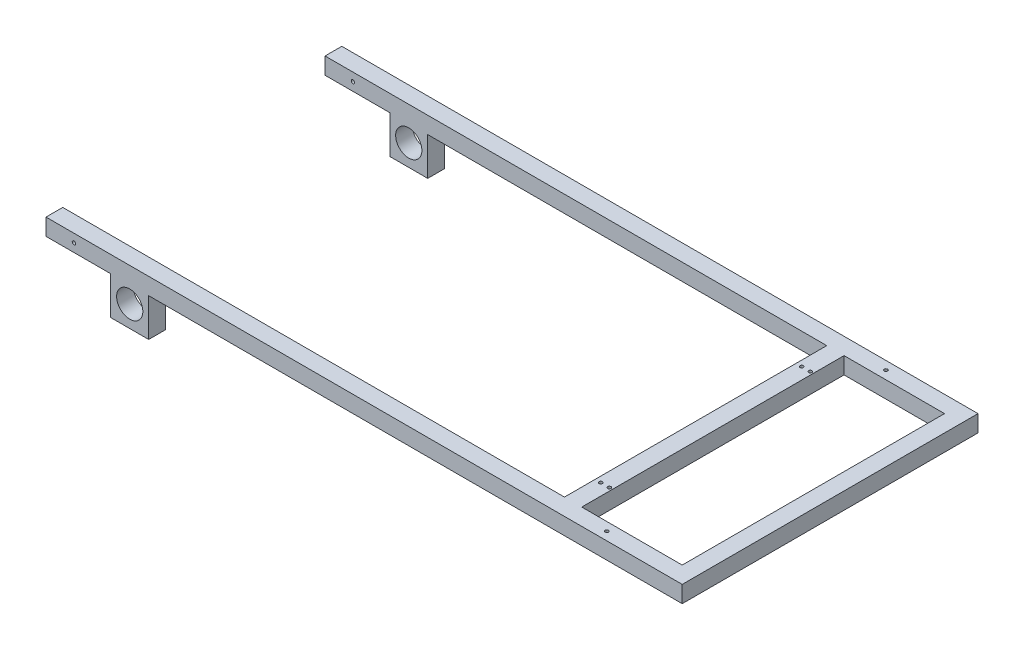
ISO-10303-21;
HEADER;
FILE_DESCRIPTION(('STEP AP214'),'2;1');
FILE_NAME('part.step','',(''),(''),'','','');
FILE_SCHEMA(('AUTOMOTIVE_DESIGN { 1 0 10303 214 1 1 1 1 }'));
ENDSEC;
DATA;
#1=APPLICATION_CONTEXT('core data for automotive mechanical design processes');
#2=APPLICATION_PROTOCOL_DEFINITION('international standard','automotive_design',2000,#1);
#3=PRODUCT_CONTEXT('',#1,'mechanical');
#4=PRODUCT('Part','Part','',(#3));
#5=PRODUCT_RELATED_PRODUCT_CATEGORY('part','',(#4));
#6=PRODUCT_DEFINITION_FORMATION('','',#4);
#7=PRODUCT_DEFINITION_CONTEXT('part definition',#1,'design');
#8=PRODUCT_DEFINITION('design','',#6,#7);
#9=PRODUCT_DEFINITION_SHAPE('','',#8);
#10=(LENGTH_UNIT() NAMED_UNIT(*) SI_UNIT(.MILLI.,.METRE.));
#11=(NAMED_UNIT(*) PLANE_ANGLE_UNIT() SI_UNIT($,.RADIAN.));
#12=(NAMED_UNIT(*) SI_UNIT($,.STERADIAN.) SOLID_ANGLE_UNIT());
#13=UNCERTAINTY_MEASURE_WITH_UNIT(LENGTH_MEASURE(1.E-05),#10,'distance_accuracy_value','');
#14=(GEOMETRIC_REPRESENTATION_CONTEXT(3) GLOBAL_UNCERTAINTY_ASSIGNED_CONTEXT((#13)) GLOBAL_UNIT_ASSIGNED_CONTEXT((#10,
#11,#12)) REPRESENTATION_CONTEXT('',''));
#15=CARTESIAN_POINT('',(0.,0.,0.));
#16=DIRECTION('',(0.,0.,1.));
#17=DIRECTION('',(1.,0.,0.));
#18=AXIS2_PLACEMENT_3D('',#15,#16,#17);
#19=CARTESIAN_POINT('',(0.,0.,0.));
#20=DIRECTION('',(0.,1.,0.));
#21=DIRECTION('',(0.,0.,1.));
#22=AXIS2_PLACEMENT_3D('',#19,#20,#21);
#23=PLANE('',#22);
#24=DIRECTION('',(1.,0.,0.));
#25=VECTOR('',#24,1.);
#26=CARTESIAN_POINT('',(-989.999999999999,0.,265.));
#27=LINE('',#26,#25);
#28=CARTESIAN_POINT('',(-150.,0.,265.));
#29=VERTEX_POINT('',#28);
#30=CARTESIAN_POINT('',(-34.,0.,265.));
#31=VERTEX_POINT('',#30);
#32=EDGE_CURVE('E206',#29,#31,#27,.T.);
#33=ORIENTED_EDGE('',*,*,#32,.F.);
#34=DIRECTION('',(0.,0.,1.));
#35=VECTOR('',#34,1.);
#36=CARTESIAN_POINT('',(-150.,0.,-265.));
#37=LINE('',#36,#35);
#38=CARTESIAN_POINT('',(-150.,0.,235.));
#39=VERTEX_POINT('',#38);
#40=EDGE_CURVE('E62',#39,#29,#37,.T.);
#41=ORIENTED_EDGE('',*,*,#40,.F.);
#42=DIRECTION('',(1.,0.,0.));
#43=VECTOR('',#42,1.);
#44=CARTESIAN_POINT('',(-959.999999999999,0.,235.));
#45=LINE('',#44,#43);
#46=CARTESIAN_POINT('',(-34.,0.,235.));
#47=VERTEX_POINT('',#46);
#48=EDGE_CURVE('E342',#39,#47,#45,.T.);
#49=ORIENTED_EDGE('',*,*,#48,.T.);
#50=DIRECTION('',(0.,0.,-1.));
#51=VECTOR('',#50,1.);
#52=CARTESIAN_POINT('',(-34.,0.,265.));
#53=LINE('',#52,#51);
#54=EDGE_CURVE('E311',#31,#47,#53,.T.);
#55=ORIENTED_EDGE('',*,*,#54,.F.);
#56=EDGE_LOOP('',(#33,#41,#49,#55));
#57=FACE_BOUND('',#56,.T.);
#58=ADVANCED_FACE('F37',(#57),#23,.F.);
#59=CARTESIAN_POINT('',(-959.999999999999,30.,-235.));
#60=DIRECTION('',(0.,0.,1.));
#61=DIRECTION('',(1.,0.,0.));
#62=AXIS2_PLACEMENT_3D('',#59,#60,#61);
#63=PLANE('',#62);
#64=CARTESIAN_POINT('',(-100.,15.0000000000003,-235.));
#65=DIRECTION('',(0.,0.,1.));
#66=DIRECTION('',(1.,0.,0.));
#67=AXIS2_PLACEMENT_3D('',#64,#65,#66);
#68=CIRCLE('',#67,3.00000000000001);
#69=CARTESIAN_POINT('',(-97.,15.0000000000003,-235.));
#70=VERTEX_POINT('',#69);
#71=EDGE_CURVE('E528',#70,#70,#68,.T.);
#72=ORIENTED_EDGE('',*,*,#71,.F.);
#73=EDGE_LOOP('',(#72));
#74=FACE_BOUND('',#73,.T.);
#75=DIRECTION('',(0.,1.,0.));
#76=VECTOR('',#75,1.);
#77=CARTESIAN_POINT('',(-150.,30.,-235.));
#78=LINE('',#77,#76);
#79=CARTESIAN_POINT('',(-150.,0.,-235.));
#80=VERTEX_POINT('',#79);
#81=CARTESIAN_POINT('',(-150.,30.0000000000005,-235.));
#82=VERTEX_POINT('',#81);
#83=EDGE_CURVE('E230',#80,#82,#78,.T.);
#84=ORIENTED_EDGE('',*,*,#83,.F.);
#85=DIRECTION('',(-1.,0.,0.));
#86=VECTOR('',#85,1.);
#87=CARTESIAN_POINT('',(-959.999999999999,0.,-235.));
#88=LINE('',#87,#86);
#89=CARTESIAN_POINT('',(-34.,0.,-235.));
#90=VERTEX_POINT('',#89);
#91=EDGE_CURVE('E189',#90,#80,#88,.T.);
#92=ORIENTED_EDGE('',*,*,#91,.F.);
#93=DIRECTION('',(0.,1.,0.));
#94=VECTOR('',#93,1.);
#95=CARTESIAN_POINT('',(-34.,-68.,-235.));
#96=LINE('',#95,#94);
#97=CARTESIAN_POINT('',(-34.,-68.,-235.));
#98=VERTEX_POINT('',#97);
#99=EDGE_CURVE('E298',#98,#90,#96,.T.);
#100=ORIENTED_EDGE('',*,*,#99,.F.);
#101=DIRECTION('',(-1.,0.,0.));
#102=VECTOR('',#101,1.);
#103=CARTESIAN_POINT('',(-34.,-68.,-235.));
#104=LINE('',#103,#102);
#105=CARTESIAN_POINT('',(34.,-68.,-235.));
#106=VERTEX_POINT('',#105);
#107=EDGE_CURVE('E296',#106,#98,#104,.T.);
#108=ORIENTED_EDGE('',*,*,#107,.F.);
#109=DIRECTION('',(0.,1.,0.));
#110=VECTOR('',#109,1.);
#111=CARTESIAN_POINT('',(34.,-68.,-235.));
#112=LINE('',#111,#110);
#113=CARTESIAN_POINT('',(33.9999999999999,0.,-235.));
#114=VERTEX_POINT('',#113);
#115=EDGE_CURVE('E304',#106,#114,#112,.T.);
#116=ORIENTED_EDGE('',*,*,#115,.T.);
#117=CARTESIAN_POINT('',(749.000000000001,0.,-235.));
#118=VERTEX_POINT('',#117);
#119=EDGE_CURVE('E356',#118,#114,#88,.T.);
#120=ORIENTED_EDGE('',*,*,#119,.F.);
#121=DIRECTION('',(0.,1.,0.));
#122=VECTOR('',#121,1.);
#123=CARTESIAN_POINT('',(749.000000000001,-471.021230943999,-235.));
#124=LINE('',#123,#122);
#125=CARTESIAN_POINT('',(749.000000000001,30.,-235.));
#126=VERTEX_POINT('',#125);
#127=EDGE_CURVE('E262',#118,#126,#124,.T.);
#128=ORIENTED_EDGE('',*,*,#127,.T.);
#129=DIRECTION('',(-1.,0.,0.));
#130=VECTOR('',#129,1.);
#131=CARTESIAN_POINT('',(-959.999999999999,30.,-235.));
#132=LINE('',#131,#130);
#133=EDGE_CURVE('E341',#126,#82,#132,.T.);
#134=ORIENTED_EDGE('',*,*,#133,.T.);
#135=EDGE_LOOP('',(#84,#92,#100,#108,#116,#120,#128,#134));
#136=FACE_BOUND('',#135,.T.);
#137=CARTESIAN_POINT('',(0.,-30.,-235.));
#138=DIRECTION('',(0.,0.,1.));
#139=DIRECTION('',(1.,0.,0.));
#140=AXIS2_PLACEMENT_3D('',#137,#138,#139);
#141=CIRCLE('',#140,23.5);
#142=CARTESIAN_POINT('',(23.5,-30.,-235.));
#143=VERTEX_POINT('',#142);
#144=EDGE_CURVE('E214',#143,#143,#141,.T.);
#145=ORIENTED_EDGE('',*,*,#144,.F.);
#146=EDGE_LOOP('',(#145));
#147=FACE_BOUND('',#146,.T.);
#148=ADVANCED_FACE('F385',(#74,#136,#147),#63,.T.);
#149=CARTESIAN_POINT('',(-959.999999999999,30.,235.));
#150=DIRECTION('',(0.,0.,-1.));
#151=DIRECTION('',(-1.,0.,0.));
#152=AXIS2_PLACEMENT_3D('',#149,#150,#151);
#153=PLANE('',#152);
#154=CARTESIAN_POINT('',(-100.,15.0000000000003,235.));
#155=DIRECTION('',(0.,0.,-1.));
#156=DIRECTION('',(-1.,0.,0.));
#157=AXIS2_PLACEMENT_3D('',#154,#155,#156);
#158=CIRCLE('',#157,3.00000000000001);
#159=CARTESIAN_POINT('',(-103.,15.0000000000003,235.));
#160=VERTEX_POINT('',#159);
#161=EDGE_CURVE('E532',#160,#160,#158,.T.);
#162=ORIENTED_EDGE('',*,*,#161,.F.);
#163=EDGE_LOOP('',(#162));
#164=FACE_BOUND('',#163,.T.);
#165=DIRECTION('',(0.,-1.,0.));
#166=VECTOR('',#165,1.);
#167=CARTESIAN_POINT('',(-150.,30.,235.));
#168=LINE('',#167,#166);
#169=CARTESIAN_POINT('',(-150.,30.0000000000005,235.));
#170=VERTEX_POINT('',#169);
#171=EDGE_CURVE('E382',#170,#39,#168,.T.);
#172=ORIENTED_EDGE('',*,*,#171,.F.);
#173=DIRECTION('',(1.,0.,0.));
#174=VECTOR('',#173,1.);
#175=CARTESIAN_POINT('',(-959.999999999999,30.,235.));
#176=LINE('',#175,#174);
#177=CARTESIAN_POINT('',(749.000000000001,30.,235.));
#178=VERTEX_POINT('',#177);
#179=EDGE_CURVE('E347',#170,#178,#176,.T.);
#180=ORIENTED_EDGE('',*,*,#179,.T.);
#181=DIRECTION('',(0.,1.,0.));
#182=VECTOR('',#181,1.);
#183=CARTESIAN_POINT('',(749.000000000001,-471.021230943999,235.));
#184=LINE('',#183,#182);
#185=CARTESIAN_POINT('',(749.000000000001,0.,235.));
#186=VERTEX_POINT('',#185);
#187=EDGE_CURVE('E271',#186,#178,#184,.T.);
#188=ORIENTED_EDGE('',*,*,#187,.F.);
#189=CARTESIAN_POINT('',(33.9999999999999,0.,235.));
#190=VERTEX_POINT('',#189);
#191=EDGE_CURVE('E358',#190,#186,#45,.T.);
#192=ORIENTED_EDGE('',*,*,#191,.F.);
#193=DIRECTION('',(0.,1.,0.));
#194=VECTOR('',#193,1.);
#195=CARTESIAN_POINT('',(33.9999999999999,-68.,235.));
#196=LINE('',#195,#194);
#197=CARTESIAN_POINT('',(33.9999999999999,-68.,235.));
#198=VERTEX_POINT('',#197);
#199=EDGE_CURVE('E332',#198,#190,#196,.T.);
#200=ORIENTED_EDGE('',*,*,#199,.F.);
#201=DIRECTION('',(1.,0.,0.));
#202=VECTOR('',#201,1.);
#203=CARTESIAN_POINT('',(-34.,-68.,235.));
#204=LINE('',#203,#202);
#205=CARTESIAN_POINT('',(-34.,-68.,235.));
#206=VERTEX_POINT('',#205);
#207=EDGE_CURVE('E315',#206,#198,#204,.T.);
#208=ORIENTED_EDGE('',*,*,#207,.F.);
#209=DIRECTION('',(0.,1.,0.));
#210=VECTOR('',#209,1.);
#211=CARTESIAN_POINT('',(-34.,-68.,235.));
#212=LINE('',#211,#210);
#213=EDGE_CURVE('E335',#206,#47,#212,.T.);
#214=ORIENTED_EDGE('',*,*,#213,.T.);
#215=ORIENTED_EDGE('',*,*,#48,.F.);
#216=EDGE_LOOP('',(#172,#180,#188,#192,#200,#208,#214,#215));
#217=FACE_BOUND('',#216,.T.);
#218=CARTESIAN_POINT('',(0.,-30.,235.));
#219=DIRECTION('',(0.,0.,-1.));
#220=DIRECTION('',(-1.,0.,0.));
#221=AXIS2_PLACEMENT_3D('',#218,#219,#220);
#222=CIRCLE('',#221,23.5);
#223=CARTESIAN_POINT('',(-23.5,-30.,235.));
#224=VERTEX_POINT('',#223);
#225=EDGE_CURVE('E212',#224,#224,#222,.T.);
#226=ORIENTED_EDGE('',*,*,#225,.F.);
#227=EDGE_LOOP('',(#226));
#228=FACE_BOUND('',#227,.T.);
#229=ADVANCED_FACE('F435',(#164,#217,#228),#153,.T.);
#230=ORIENTED_EDGE('',*,*,#91,.T.);
#231=CARTESIAN_POINT('',(-150.,0.,-265.));
#232=VERTEX_POINT('',#231);
#233=EDGE_CURVE('E176',#232,#80,#37,.T.);
#234=ORIENTED_EDGE('',*,*,#233,.F.);
#235=DIRECTION('',(-1.,0.,0.));
#236=VECTOR('',#235,1.);
#237=CARTESIAN_POINT('',(-990.,0.,-265.));
#238=LINE('',#237,#236);
#239=CARTESIAN_POINT('',(-34.,0.,-265.));
#240=VERTEX_POINT('',#239);
#241=EDGE_CURVE('E187',#240,#232,#238,.T.);
#242=ORIENTED_EDGE('',*,*,#241,.F.);
#243=DIRECTION('',(0.,0.,-1.));
#244=VECTOR('',#243,1.);
#245=CARTESIAN_POINT('',(-34.,0.,-235.));
#246=LINE('',#245,#244);
#247=EDGE_CURVE('E287',#90,#240,#246,.T.);
#248=ORIENTED_EDGE('',*,*,#247,.F.);
#249=EDGE_LOOP('',(#230,#234,#242,#248));
#250=FACE_BOUND('',#249,.T.);
#251=ADVANCED_FACE('F185',(#250),#23,.F.);
#252=CARTESIAN_POINT('',(840.000000000001,0.,-250.));
#253=DIRECTION('',(0.,1.,0.));
#254=DIRECTION('',(0.,0.,1.));
#255=AXIS2_PLACEMENT_3D('',#252,#253,#254);
#256=CIRCLE('',#255,3.00000000000005);
#257=CARTESIAN_POINT('',(840.000000000001,0.,-247.));
#258=VERTEX_POINT('',#257);
#259=EDGE_CURVE('E219',#258,#258,#256,.F.);
#260=ORIENTED_EDGE('',*,*,#259,.F.);
#261=EDGE_LOOP('',(#260));
#262=FACE_BOUND('',#261,.T.);
#263=CARTESIAN_POINT('',(840.000000000001,0.,250.));
#264=DIRECTION('',(0.,1.,0.));
#265=DIRECTION('',(0.,0.,1.));
#266=AXIS2_PLACEMENT_3D('',#263,#264,#265);
#267=CIRCLE('',#266,3.00000000000005);
#268=CARTESIAN_POINT('',(840.000000000001,0.,253.));
#269=VERTEX_POINT('',#268);
#270=EDGE_CURVE('E218',#269,#269,#267,.T.);
#271=ORIENTED_EDGE('',*,*,#270,.T.);
#272=EDGE_LOOP('',(#271));
#273=FACE_BOUND('',#272,.T.);
#274=CARTESIAN_POINT('',(774.500000000001,0.,-180.));
#275=DIRECTION('',(0.,1.,0.));
#276=DIRECTION('',(0.,0.,1.));
#277=AXIS2_PLACEMENT_3D('',#274,#275,#276);
#278=CIRCLE('',#277,3.00000000000005);
#279=CARTESIAN_POINT('',(774.500000000001,0.,-177.));
#280=VERTEX_POINT('',#279);
#281=EDGE_CURVE('E248',#280,#280,#278,.T.);
#282=ORIENTED_EDGE('',*,*,#281,.T.);
#283=EDGE_LOOP('',(#282));
#284=FACE_BOUND('',#283,.T.);
#285=CARTESIAN_POINT('',(759.000000000001,0.,180.));
#286=DIRECTION('',(0.,1.,0.));
#287=DIRECTION('',(0.,0.,1.));
#288=AXIS2_PLACEMENT_3D('',#285,#286,#287);
#289=CIRCLE('',#288,3.00000000000005);
#290=CARTESIAN_POINT('',(759.000000000001,0.,183.));
#291=VERTEX_POINT('',#290);
#292=EDGE_CURVE('E245',#291,#291,#289,.T.);
#293=ORIENTED_EDGE('',*,*,#292,.T.);
#294=EDGE_LOOP('',(#293));
#295=FACE_BOUND('',#294,.T.);
#296=CARTESIAN_POINT('',(774.500000000001,0.,180.));
#297=DIRECTION('',(0.,1.,0.));
#298=DIRECTION('',(0.,0.,1.));
#299=AXIS2_PLACEMENT_3D('',#296,#297,#298);
#300=CIRCLE('',#299,3.00000000000005);
#301=CARTESIAN_POINT('',(774.500000000001,0.,183.));
#302=VERTEX_POINT('',#301);
#303=EDGE_CURVE('E237',#302,#302,#300,.T.);
#304=ORIENTED_EDGE('',*,*,#303,.T.);
#305=EDGE_LOOP('',(#304));
#306=FACE_BOUND('',#305,.T.);
#307=CARTESIAN_POINT('',(759.000000000001,0.,-180.));
#308=DIRECTION('',(0.,1.,0.));
#309=DIRECTION('',(0.,0.,1.));
#310=AXIS2_PLACEMENT_3D('',#307,#308,#309);
#311=CIRCLE('',#310,3.00000000000005);
#312=CARTESIAN_POINT('',(759.000000000001,0.,-177.));
#313=VERTEX_POINT('',#312);
#314=EDGE_CURVE('E254',#313,#313,#311,.T.);
#315=ORIENTED_EDGE('',*,*,#314,.T.);
#316=EDGE_LOOP('',(#315));
#317=FACE_BOUND('',#316,.T.);
#318=CARTESIAN_POINT('',(960.000000000001,0.,-235.));
#319=VERTEX_POINT('',#318);
#320=CARTESIAN_POINT('',(780.000000000001,0.,-235.));
#321=VERTEX_POINT('',#320);
#322=EDGE_CURVE('E352',#319,#321,#88,.T.);
#323=ORIENTED_EDGE('',*,*,#322,.T.);
#324=DIRECTION('',(0.,0.,1.));
#325=VECTOR('',#324,1.);
#326=CARTESIAN_POINT('',(780.000000000001,0.,-235.));
#327=LINE('',#326,#325);
#328=CARTESIAN_POINT('',(780.000000000001,0.,235.));
#329=VERTEX_POINT('',#328);
#330=EDGE_CURVE('E258',#321,#329,#327,.T.);
#331=ORIENTED_EDGE('',*,*,#330,.T.);
#332=CARTESIAN_POINT('',(960.000000000001,0.,235.));
#333=VERTEX_POINT('',#332);
#334=EDGE_CURVE('E355',#329,#333,#45,.T.);
#335=ORIENTED_EDGE('',*,*,#334,.T.);
#336=DIRECTION('',(0.,0.,-1.));
#337=VECTOR('',#336,1.);
#338=CARTESIAN_POINT('',(960.000000000001,0.,-235.));
#339=LINE('',#338,#337);
#340=EDGE_CURVE('E338',#333,#319,#339,.T.);
#341=ORIENTED_EDGE('',*,*,#340,.T.);
#342=EDGE_LOOP('',(#323,#331,#335,#341));
#343=FACE_BOUND('',#342,.T.);
#344=DIRECTION('',(0.,0.,1.));
#345=VECTOR('',#344,1.);
#346=CARTESIAN_POINT('',(34.,0.,-235.));
#347=LINE('',#346,#345);
#348=CARTESIAN_POINT('',(34.,0.,-265.));
#349=VERTEX_POINT('',#348);
#350=EDGE_CURVE('E292',#349,#114,#347,.T.);
#351=ORIENTED_EDGE('',*,*,#350,.F.);
#352=CARTESIAN_POINT('',(990.,0.,-265.));
#353=VERTEX_POINT('',#352);
#354=EDGE_CURVE('E196',#353,#349,#238,.T.);
#355=ORIENTED_EDGE('',*,*,#354,.F.);
#356=DIRECTION('',(0.,0.,-1.));
#357=VECTOR('',#356,1.);
#358=CARTESIAN_POINT('',(990.,0.,-265.));
#359=LINE('',#358,#357);
#360=CARTESIAN_POINT('',(990.000000000001,0.,265.));
#361=VERTEX_POINT('',#360);
#362=EDGE_CURVE('E197',#361,#353,#359,.T.);
#363=ORIENTED_EDGE('',*,*,#362,.F.);
#364=CARTESIAN_POINT('',(34.,0.,265.));
#365=VERTEX_POINT('',#364);
#366=EDGE_CURVE('E200',#365,#361,#27,.T.);
#367=ORIENTED_EDGE('',*,*,#366,.F.);
#368=DIRECTION('',(0.,0.,1.));
#369=VECTOR('',#368,1.);
#370=CARTESIAN_POINT('',(34.,0.,265.));
#371=LINE('',#370,#369);
#372=EDGE_CURVE('E316',#190,#365,#371,.T.);
#373=ORIENTED_EDGE('',*,*,#372,.F.);
#374=ORIENTED_EDGE('',*,*,#191,.T.);
#375=DIRECTION('',(0.,0.,-1.));
#376=VECTOR('',#375,1.);
#377=CARTESIAN_POINT('',(749.000000000001,0.,-235.));
#378=LINE('',#377,#376);
#379=EDGE_CURVE('E261',#186,#118,#378,.T.);
#380=ORIENTED_EDGE('',*,*,#379,.T.);
#381=ORIENTED_EDGE('',*,*,#119,.T.);
#382=EDGE_LOOP('',(#351,#355,#363,#367,#373,#374,#380,#381));
#383=FACE_BOUND('',#382,.T.);
#384=ADVANCED_FACE('F393',(#262,#273,#284,#295,#306,#317,#343,#383),#23,.F.);
#385=CARTESIAN_POINT('',(0.,30.,0.));
#386=DIRECTION('',(0.,1.,0.));
#387=DIRECTION('',(0.,0.,1.));
#388=AXIS2_PLACEMENT_3D('',#385,#386,#387);
#389=PLANE('',#388);
#390=DIRECTION('',(0.,0.,1.));
#391=VECTOR('',#390,1.);
#392=CARTESIAN_POINT('',(-150.,30.0000000000005,-265.));
#393=LINE('',#392,#391);
#394=CARTESIAN_POINT('',(-150.,30.0000000000005,265.));
#395=VERTEX_POINT('',#394);
#396=EDGE_CURVE('E190',#170,#395,#393,.T.);
#397=ORIENTED_EDGE('',*,*,#396,.T.);
#398=DIRECTION('',(1.,0.,0.));
#399=VECTOR('',#398,1.);
#400=CARTESIAN_POINT('',(-989.999999999999,30.,265.));
#401=LINE('',#400,#399);
#402=CARTESIAN_POINT('',(990.000000000001,30.,265.));
#403=VERTEX_POINT('',#402);
#404=EDGE_CURVE('E210',#395,#403,#401,.T.);
#405=ORIENTED_EDGE('',*,*,#404,.T.);
#406=DIRECTION('',(0.,0.,-1.));
#407=VECTOR('',#406,1.);
#408=CARTESIAN_POINT('',(990.,30.,-265.));
#409=LINE('',#408,#407);
#410=CARTESIAN_POINT('',(990.,30.,-265.));
#411=VERTEX_POINT('',#410);
#412=EDGE_CURVE('E208',#403,#411,#409,.T.);
#413=ORIENTED_EDGE('',*,*,#412,.T.);
#414=DIRECTION('',(-1.,0.,0.));
#415=VECTOR('',#414,1.);
#416=CARTESIAN_POINT('',(-990.,30.,-265.));
#417=LINE('',#416,#415);
#418=CARTESIAN_POINT('',(-150.,30.,-265.));
#419=VERTEX_POINT('',#418);
#420=EDGE_CURVE('E365',#411,#419,#417,.T.);
#421=ORIENTED_EDGE('',*,*,#420,.T.);
#422=EDGE_CURVE('E54',#419,#82,#393,.T.);
#423=ORIENTED_EDGE('',*,*,#422,.T.);
#424=ORIENTED_EDGE('',*,*,#133,.F.);
#425=DIRECTION('',(0.,0.,1.));
#426=VECTOR('',#425,1.);
#427=CARTESIAN_POINT('',(749.000000000001,30.,-235.));
#428=LINE('',#427,#426);
#429=EDGE_CURVE('E257',#126,#178,#428,.T.);
#430=ORIENTED_EDGE('',*,*,#429,.T.);
#431=ORIENTED_EDGE('',*,*,#179,.F.);
#432=EDGE_LOOP('',(#397,#405,#413,#421,#423,#424,#430,#431));
#433=FACE_BOUND('',#432,.T.);
#434=CARTESIAN_POINT('',(840.000000000001,30.,-250.));
#435=DIRECTION('',(0.,1.,0.));
#436=DIRECTION('',(0.,0.,1.));
#437=AXIS2_PLACEMENT_3D('',#434,#435,#436);
#438=CIRCLE('',#437,3.00000000000005);
#439=CARTESIAN_POINT('',(840.000000000001,30.,-247.));
#440=VERTEX_POINT('',#439);
#441=EDGE_CURVE('E41',#440,#440,#438,.F.);
#442=ORIENTED_EDGE('',*,*,#441,.T.);
#443=EDGE_LOOP('',(#442));
#444=FACE_BOUND('',#443,.T.);
#445=CARTESIAN_POINT('',(840.000000000001,30.,250.));
#446=DIRECTION('',(0.,1.,0.));
#447=DIRECTION('',(0.,0.,1.));
#448=AXIS2_PLACEMENT_3D('',#445,#446,#447);
#449=CIRCLE('',#448,3.00000000000005);
#450=CARTESIAN_POINT('',(840.000000000001,30.,253.));
#451=VERTEX_POINT('',#450);
#452=EDGE_CURVE('E216',#451,#451,#449,.T.);
#453=ORIENTED_EDGE('',*,*,#452,.F.);
#454=EDGE_LOOP('',(#453));
#455=FACE_BOUND('',#454,.T.);
#456=CARTESIAN_POINT('',(774.500000000001,30.,-180.));
#457=DIRECTION('',(0.,1.,0.));
#458=DIRECTION('',(0.,0.,1.));
#459=AXIS2_PLACEMENT_3D('',#456,#457,#458);
#460=CIRCLE('',#459,3.00000000000005);
#461=CARTESIAN_POINT('',(774.500000000001,30.,-177.));
#462=VERTEX_POINT('',#461);
#463=EDGE_CURVE('E234',#462,#462,#460,.T.);
#464=ORIENTED_EDGE('',*,*,#463,.F.);
#465=EDGE_LOOP('',(#464));
#466=FACE_BOUND('',#465,.T.);
#467=CARTESIAN_POINT('',(759.000000000001,30.,180.));
#468=DIRECTION('',(0.,1.,0.));
#469=DIRECTION('',(0.,0.,-1.));
#470=AXIS2_PLACEMENT_3D('',#467,#468,#469);
#471=CIRCLE('',#470,3.00000000000005);
#472=CARTESIAN_POINT('',(759.000000000001,30.,177.));
#473=VERTEX_POINT('',#472);
#474=EDGE_CURVE('E238',#473,#473,#471,.T.);
#475=ORIENTED_EDGE('',*,*,#474,.F.);
#476=EDGE_LOOP('',(#475));
#477=FACE_BOUND('',#476,.T.);
#478=CARTESIAN_POINT('',(774.500000000001,30.,180.));
#479=DIRECTION('',(0.,1.,0.));
#480=DIRECTION('',(0.,0.,-1.));
#481=AXIS2_PLACEMENT_3D('',#478,#479,#480);
#482=CIRCLE('',#481,3.00000000000005);
#483=CARTESIAN_POINT('',(774.500000000001,30.,177.));
#484=VERTEX_POINT('',#483);
#485=EDGE_CURVE('E223',#484,#484,#482,.T.);
#486=ORIENTED_EDGE('',*,*,#485,.F.);
#487=EDGE_LOOP('',(#486));
#488=FACE_BOUND('',#487,.T.);
#489=CARTESIAN_POINT('',(759.000000000001,30.,-180.));
#490=DIRECTION('',(0.,1.,0.));
#491=DIRECTION('',(0.,0.,1.));
#492=AXIS2_PLACEMENT_3D('',#489,#490,#491);
#493=CIRCLE('',#492,3.00000000000005);
#494=CARTESIAN_POINT('',(759.000000000001,30.,-177.));
#495=VERTEX_POINT('',#494);
#496=EDGE_CURVE('E251',#495,#495,#493,.T.);
#497=ORIENTED_EDGE('',*,*,#496,.F.);
#498=EDGE_LOOP('',(#497));
#499=FACE_BOUND('',#498,.T.);
#500=CARTESIAN_POINT('',(960.000000000001,30.,-235.));
#501=VERTEX_POINT('',#500);
#502=CARTESIAN_POINT('',(780.000000000001,30.,-235.));
#503=VERTEX_POINT('',#502);
#504=EDGE_CURVE('E343',#501,#503,#132,.T.);
#505=ORIENTED_EDGE('',*,*,#504,.F.);
#506=DIRECTION('',(0.,0.,-1.));
#507=VECTOR('',#506,1.);
#508=CARTESIAN_POINT('',(960.000000000001,30.,-235.));
#509=LINE('',#508,#507);
#510=CARTESIAN_POINT('',(960.000000000001,30.,235.));
#511=VERTEX_POINT('',#510);
#512=EDGE_CURVE('E339',#511,#501,#509,.T.);
#513=ORIENTED_EDGE('',*,*,#512,.F.);
#514=CARTESIAN_POINT('',(780.000000000001,30.,235.));
#515=VERTEX_POINT('',#514);
#516=EDGE_CURVE('E346',#515,#511,#176,.T.);
#517=ORIENTED_EDGE('',*,*,#516,.F.);
#518=DIRECTION('',(0.,0.,-1.));
#519=VECTOR('',#518,1.);
#520=CARTESIAN_POINT('',(780.000000000001,30.,-235.));
#521=LINE('',#520,#519);
#522=EDGE_CURVE('E268',#515,#503,#521,.T.);
#523=ORIENTED_EDGE('',*,*,#522,.T.);
#524=EDGE_LOOP('',(#505,#513,#517,#523));
#525=FACE_BOUND('',#524,.T.);
#526=ADVANCED_FACE('F370',(#433,#444,#455,#466,#477,#488,#499,#525),#389,.T.);
#527=CARTESIAN_POINT('',(990.,30.,-265.));
#528=DIRECTION('',(-1.,0.,0.));
#529=DIRECTION('',(0.,0.,1.));
#530=AXIS2_PLACEMENT_3D('',#527,#528,#529);
#531=PLANE('',#530);
#532=ORIENTED_EDGE('',*,*,#362,.T.);
#533=DIRECTION('',(0.,-1.,0.));
#534=VECTOR('',#533,1.);
#535=CARTESIAN_POINT('',(990.,30.,-265.));
#536=LINE('',#535,#534);
#537=EDGE_CURVE('E11',#411,#353,#536,.T.);
#538=ORIENTED_EDGE('',*,*,#537,.F.);
#539=ORIENTED_EDGE('',*,*,#412,.F.);
#540=DIRECTION('',(0.,-1.,0.));
#541=VECTOR('',#540,1.);
#542=CARTESIAN_POINT('',(990.000000000001,30.,265.));
#543=LINE('',#542,#541);
#544=EDGE_CURVE('E46',#403,#361,#543,.T.);
#545=ORIENTED_EDGE('',*,*,#544,.T.);
#546=EDGE_LOOP('',(#532,#538,#539,#545));
#547=FACE_BOUND('',#546,.T.);
#548=ADVANCED_FACE('F39',(#547),#531,.F.);
#549=CARTESIAN_POINT('',(-990.,30.,-265.));
#550=DIRECTION('',(0.,0.,1.));
#551=DIRECTION('',(1.,0.,0.));
#552=AXIS2_PLACEMENT_3D('',#549,#550,#551);
#553=PLANE('',#552);
#554=CARTESIAN_POINT('',(-100.,15.0000000000003,-265.));
#555=DIRECTION('',(0.,0.,1.));
#556=DIRECTION('',(1.,0.,0.));
#557=AXIS2_PLACEMENT_3D('',#554,#555,#556);
#558=CIRCLE('',#557,3.00000000000001);
#559=CARTESIAN_POINT('',(-97.,15.0000000000003,-265.));
#560=VERTEX_POINT('',#559);
#561=EDGE_CURVE('E482',#560,#560,#558,.T.);
#562=ORIENTED_EDGE('',*,*,#561,.T.);
#563=EDGE_LOOP('',(#562));
#564=FACE_BOUND('',#563,.T.);
#565=CARTESIAN_POINT('',(0.,-30.,-265.));
#566=DIRECTION('',(0.,0.,1.));
#567=DIRECTION('',(1.,0.,0.));
#568=AXIS2_PLACEMENT_3D('',#565,#566,#567);
#569=CIRCLE('',#568,23.5);
#570=CARTESIAN_POINT('',(23.5,-30.,-265.));
#571=VERTEX_POINT('',#570);
#572=EDGE_CURVE('E215',#571,#571,#569,.T.);
#573=ORIENTED_EDGE('',*,*,#572,.T.);
#574=EDGE_LOOP('',(#573));
#575=FACE_BOUND('',#574,.T.);
#576=ORIENTED_EDGE('',*,*,#241,.T.);
#577=DIRECTION('',(0.,1.,0.));
#578=VECTOR('',#577,1.);
#579=CARTESIAN_POINT('',(-150.,30.0000000000005,-265.));
#580=LINE('',#579,#578);
#581=EDGE_CURVE('E173',#232,#419,#580,.T.);
#582=ORIENTED_EDGE('',*,*,#581,.T.);
#583=ORIENTED_EDGE('',*,*,#420,.F.);
#584=ORIENTED_EDGE('',*,*,#537,.T.);
#585=ORIENTED_EDGE('',*,*,#354,.T.);
#586=DIRECTION('',(0.,1.,0.));
#587=VECTOR('',#586,1.);
#588=CARTESIAN_POINT('',(34.,-68.,-265.));
#589=LINE('',#588,#587);
#590=CARTESIAN_POINT('',(34.,-68.,-265.));
#591=VERTEX_POINT('',#590);
#592=EDGE_CURVE('E307',#591,#349,#589,.T.);
#593=ORIENTED_EDGE('',*,*,#592,.F.);
#594=DIRECTION('',(1.,0.,0.));
#595=VECTOR('',#594,1.);
#596=CARTESIAN_POINT('',(-34.,-68.,-265.));
#597=LINE('',#596,#595);
#598=CARTESIAN_POINT('',(-34.,-68.,-265.));
#599=VERTEX_POINT('',#598);
#600=EDGE_CURVE('E291',#599,#591,#597,.T.);
#601=ORIENTED_EDGE('',*,*,#600,.F.);
#602=DIRECTION('',(0.,1.,0.));
#603=VECTOR('',#602,1.);
#604=CARTESIAN_POINT('',(-34.,-68.,-265.));
#605=LINE('',#604,#603);
#606=EDGE_CURVE('E194',#599,#240,#605,.T.);
#607=ORIENTED_EDGE('',*,*,#606,.T.);
#608=EDGE_LOOP('',(#576,#582,#583,#584,#585,#593,#601,#607));
#609=FACE_BOUND('',#608,.T.);
#610=ADVANCED_FACE('F192',(#564,#575,#609),#553,.F.);
#611=CARTESIAN_POINT('',(-989.999999999999,30.,265.));
#612=DIRECTION('',(0.,0.,-1.));
#613=DIRECTION('',(-1.,0.,0.));
#614=AXIS2_PLACEMENT_3D('',#611,#612,#613);
#615=PLANE('',#614);
#616=CARTESIAN_POINT('',(-100.,15.0000000000003,265.));
#617=DIRECTION('',(0.,0.,1.));
#618=DIRECTION('',(1.,0.,0.));
#619=AXIS2_PLACEMENT_3D('',#616,#617,#618);
#620=CIRCLE('',#619,3.00000000000001);
#621=CARTESIAN_POINT('',(-97.,15.0000000000003,265.));
#622=VERTEX_POINT('',#621);
#623=EDGE_CURVE('E535',#622,#622,#620,.T.);
#624=ORIENTED_EDGE('',*,*,#623,.F.);
#625=EDGE_LOOP('',(#624));
#626=FACE_BOUND('',#625,.T.);
#627=CARTESIAN_POINT('',(0.,-30.,265.));
#628=DIRECTION('',(0.,0.,1.));
#629=DIRECTION('',(1.,0.,0.));
#630=AXIS2_PLACEMENT_3D('',#627,#628,#629);
#631=CIRCLE('',#630,23.5);
#632=CARTESIAN_POINT('',(23.5,-30.,265.));
#633=VERTEX_POINT('',#632);
#634=EDGE_CURVE('E265',#633,#633,#631,.T.);
#635=ORIENTED_EDGE('',*,*,#634,.F.);
#636=EDGE_LOOP('',(#635));
#637=FACE_BOUND('',#636,.T.);
#638=ORIENTED_EDGE('',*,*,#404,.F.);
#639=DIRECTION('',(0.,1.,0.));
#640=VECTOR('',#639,1.);
#641=CARTESIAN_POINT('',(-150.,30.0000000000005,265.));
#642=LINE('',#641,#640);
#643=EDGE_CURVE('E181',#29,#395,#642,.T.);
#644=ORIENTED_EDGE('',*,*,#643,.F.);
#645=ORIENTED_EDGE('',*,*,#32,.T.);
#646=DIRECTION('',(0.,1.,0.));
#647=VECTOR('',#646,1.);
#648=CARTESIAN_POINT('',(-34.,-68.,265.));
#649=LINE('',#648,#647);
#650=CARTESIAN_POINT('',(-34.,-68.,265.));
#651=VERTEX_POINT('',#650);
#652=EDGE_CURVE('E322',#651,#31,#649,.T.);
#653=ORIENTED_EDGE('',*,*,#652,.F.);
#654=DIRECTION('',(-1.,0.,0.));
#655=VECTOR('',#654,1.);
#656=CARTESIAN_POINT('',(-34.,-68.,265.));
#657=LINE('',#656,#655);
#658=CARTESIAN_POINT('',(34.,-68.,265.));
#659=VERTEX_POINT('',#658);
#660=EDGE_CURVE('E320',#659,#651,#657,.T.);
#661=ORIENTED_EDGE('',*,*,#660,.F.);
#662=DIRECTION('',(0.,1.,0.));
#663=VECTOR('',#662,1.);
#664=CARTESIAN_POINT('',(34.,-68.,265.));
#665=LINE('',#664,#663);
#666=EDGE_CURVE('E329',#659,#365,#665,.T.);
#667=ORIENTED_EDGE('',*,*,#666,.T.);
#668=ORIENTED_EDGE('',*,*,#366,.T.);
#669=ORIENTED_EDGE('',*,*,#544,.F.);
#670=EDGE_LOOP('',(#638,#644,#645,#653,#661,#667,#668,#669));
#671=FACE_BOUND('',#670,.T.);
#672=ADVANCED_FACE('F376',(#626,#637,#671),#615,.F.);
#673=CARTESIAN_POINT('',(960.000000000001,30.,-235.));
#674=DIRECTION('',(-1.,0.,0.));
#675=DIRECTION('',(0.,0.,1.));
#676=AXIS2_PLACEMENT_3D('',#673,#674,#675);
#677=PLANE('',#676);
#678=ORIENTED_EDGE('',*,*,#340,.F.);
#679=DIRECTION('',(0.,-1.,0.));
#680=VECTOR('',#679,1.);
#681=CARTESIAN_POINT('',(960.000000000001,30.,235.));
#682=LINE('',#681,#680);
#683=EDGE_CURVE('E349',#511,#333,#682,.T.);
#684=ORIENTED_EDGE('',*,*,#683,.F.);
#685=ORIENTED_EDGE('',*,*,#512,.T.);
#686=DIRECTION('',(0.,-1.,0.));
#687=VECTOR('',#686,1.);
#688=CARTESIAN_POINT('',(960.000000000001,30.,-235.));
#689=LINE('',#688,#687);
#690=EDGE_CURVE('E202',#501,#319,#689,.T.);
#691=ORIENTED_EDGE('',*,*,#690,.T.);
#692=EDGE_LOOP('',(#678,#684,#685,#691));
#693=FACE_BOUND('',#692,.T.);
#694=ADVANCED_FACE('F403',(#693),#677,.T.);
#695=DIRECTION('',(0.,1.,0.));
#696=VECTOR('',#695,1.);
#697=CARTESIAN_POINT('',(780.000000000001,-471.021230943999,-235.));
#698=LINE('',#697,#696);
#699=EDGE_CURVE('E274',#321,#503,#698,.T.);
#700=ORIENTED_EDGE('',*,*,#699,.F.);
#701=ORIENTED_EDGE('',*,*,#322,.F.);
#702=ORIENTED_EDGE('',*,*,#690,.F.);
#703=ORIENTED_EDGE('',*,*,#504,.T.);
#704=EDGE_LOOP('',(#700,#701,#702,#703));
#705=FACE_BOUND('',#704,.T.);
#706=ADVANCED_FACE('F412',(#705),#63,.T.);
#707=DIRECTION('',(0.,1.,0.));
#708=VECTOR('',#707,1.);
#709=CARTESIAN_POINT('',(780.000000000001,-471.021230943999,235.));
#710=LINE('',#709,#708);
#711=EDGE_CURVE('E276',#329,#515,#710,.T.);
#712=ORIENTED_EDGE('',*,*,#711,.T.);
#713=ORIENTED_EDGE('',*,*,#516,.T.);
#714=ORIENTED_EDGE('',*,*,#683,.T.);
#715=ORIENTED_EDGE('',*,*,#334,.F.);
#716=EDGE_LOOP('',(#712,#713,#714,#715));
#717=FACE_BOUND('',#716,.T.);
#718=ADVANCED_FACE('F406',(#717),#153,.T.);
#719=CARTESIAN_POINT('',(-34.,-68.,265.));
#720=DIRECTION('',(1.,0.,0.));
#721=DIRECTION('',(0.,0.,-1.));
#722=AXIS2_PLACEMENT_3D('',#719,#720,#721);
#723=PLANE('',#722);
#724=ORIENTED_EDGE('',*,*,#54,.T.);
#725=ORIENTED_EDGE('',*,*,#213,.F.);
#726=DIRECTION('',(0.,0.,-1.));
#727=VECTOR('',#726,1.);
#728=CARTESIAN_POINT('',(-34.,-68.,265.));
#729=LINE('',#728,#727);
#730=EDGE_CURVE('E312',#651,#206,#729,.T.);
#731=ORIENTED_EDGE('',*,*,#730,.F.);
#732=ORIENTED_EDGE('',*,*,#652,.T.);
#733=EDGE_LOOP('',(#724,#725,#731,#732));
#734=FACE_BOUND('',#733,.T.);
#735=ADVANCED_FACE('F455',(#734),#723,.F.);
#736=CARTESIAN_POINT('',(34.,-68.,265.));
#737=DIRECTION('',(-1.,0.,0.));
#738=DIRECTION('',(0.,0.,1.));
#739=AXIS2_PLACEMENT_3D('',#736,#737,#738);
#740=PLANE('',#739);
#741=ORIENTED_EDGE('',*,*,#372,.T.);
#742=ORIENTED_EDGE('',*,*,#666,.F.);
#743=DIRECTION('',(0.,0.,1.));
#744=VECTOR('',#743,1.);
#745=CARTESIAN_POINT('',(34.,-68.,265.));
#746=LINE('',#745,#744);
#747=EDGE_CURVE('E318',#198,#659,#746,.T.);
#748=ORIENTED_EDGE('',*,*,#747,.F.);
#749=ORIENTED_EDGE('',*,*,#199,.T.);
#750=EDGE_LOOP('',(#741,#742,#748,#749));
#751=FACE_BOUND('',#750,.T.);
#752=ADVANCED_FACE('F461',(#751),#740,.F.);
#753=CARTESIAN_POINT('',(0.,-68.,0.));
#754=DIRECTION('',(0.,-1.,0.));
#755=DIRECTION('',(0.,0.,-1.));
#756=AXIS2_PLACEMENT_3D('',#753,#754,#755);
#757=PLANE('',#756);
#758=ORIENTED_EDGE('',*,*,#730,.T.);
#759=ORIENTED_EDGE('',*,*,#207,.T.);
#760=ORIENTED_EDGE('',*,*,#747,.T.);
#761=ORIENTED_EDGE('',*,*,#660,.T.);
#762=EDGE_LOOP('',(#758,#759,#760,#761));
#763=FACE_BOUND('',#762,.T.);
#764=ADVANCED_FACE('F505',(#763),#757,.T.);
#765=CARTESIAN_POINT('',(-34.,-68.,-235.));
#766=DIRECTION('',(1.,0.,0.));
#767=DIRECTION('',(0.,0.,-1.));
#768=AXIS2_PLACEMENT_3D('',#765,#766,#767);
#769=PLANE('',#768);
#770=ORIENTED_EDGE('',*,*,#247,.T.);
#771=ORIENTED_EDGE('',*,*,#606,.F.);
#772=DIRECTION('',(0.,0.,-1.));
#773=VECTOR('',#772,1.);
#774=CARTESIAN_POINT('',(-34.,-68.,-235.));
#775=LINE('',#774,#773);
#776=EDGE_CURVE('E288',#98,#599,#775,.T.);
#777=ORIENTED_EDGE('',*,*,#776,.F.);
#778=ORIENTED_EDGE('',*,*,#99,.T.);
#779=EDGE_LOOP('',(#770,#771,#777,#778));
#780=FACE_BOUND('',#779,.T.);
#781=ADVANCED_FACE('F501',(#780),#769,.F.);
#782=CARTESIAN_POINT('',(34.,-68.,-235.));
#783=DIRECTION('',(-1.,0.,0.));
#784=DIRECTION('',(0.,0.,1.));
#785=AXIS2_PLACEMENT_3D('',#782,#783,#784);
#786=PLANE('',#785);
#787=ORIENTED_EDGE('',*,*,#350,.T.);
#788=ORIENTED_EDGE('',*,*,#115,.F.);
#789=DIRECTION('',(0.,0.,1.));
#790=VECTOR('',#789,1.);
#791=CARTESIAN_POINT('',(34.,-68.,-235.));
#792=LINE('',#791,#790);
#793=EDGE_CURVE('E294',#591,#106,#792,.T.);
#794=ORIENTED_EDGE('',*,*,#793,.F.);
#795=ORIENTED_EDGE('',*,*,#592,.T.);
#796=EDGE_LOOP('',(#787,#788,#794,#795));
#797=FACE_BOUND('',#796,.T.);
#798=ADVANCED_FACE('F497',(#797),#786,.F.);
#799=CARTESIAN_POINT('',(0.,-68.,0.));
#800=DIRECTION('',(0.,-1.,0.));
#801=DIRECTION('',(0.,0.,-1.));
#802=AXIS2_PLACEMENT_3D('',#799,#800,#801);
#803=PLANE('',#802);
#804=ORIENTED_EDGE('',*,*,#776,.T.);
#805=ORIENTED_EDGE('',*,*,#600,.T.);
#806=ORIENTED_EDGE('',*,*,#793,.T.);
#807=ORIENTED_EDGE('',*,*,#107,.T.);
#808=EDGE_LOOP('',(#804,#805,#806,#807));
#809=FACE_BOUND('',#808,.T.);
#810=ADVANCED_FACE('F492',(#809),#803,.T.);
#811=CARTESIAN_POINT('',(0.,-30.,-265.));
#812=DIRECTION('',(0.,0.,1.));
#813=DIRECTION('',(1.,0.,0.));
#814=AXIS2_PLACEMENT_3D('',#811,#812,#813);
#815=CYLINDRICAL_SURFACE('',#814,23.5);
#816=ORIENTED_EDGE('',*,*,#225,.T.);
#817=EDGE_LOOP('',(#816));
#818=FACE_BOUND('',#817,.T.);
#819=ORIENTED_EDGE('',*,*,#634,.T.);
#820=EDGE_LOOP('',(#819));
#821=FACE_BOUND('',#820,.T.);
#822=ADVANCED_FACE('F486',(#818,#821),#815,.F.);
#823=ORIENTED_EDGE('',*,*,#144,.T.);
#824=EDGE_LOOP('',(#823));
#825=FACE_BOUND('',#824,.T.);
#826=ORIENTED_EDGE('',*,*,#572,.F.);
#827=EDGE_LOOP('',(#826));
#828=FACE_BOUND('',#827,.T.);
#829=ADVANCED_FACE('F425',(#825,#828),#815,.F.);
#830=CARTESIAN_POINT('',(749.000000000001,-471.021230943999,-235.));
#831=DIRECTION('',(-1.,0.,0.));
#832=DIRECTION('',(0.,0.,1.));
#833=AXIS2_PLACEMENT_3D('',#830,#831,#832);
#834=PLANE('',#833);
#835=ORIENTED_EDGE('',*,*,#379,.F.);
#836=ORIENTED_EDGE('',*,*,#187,.T.);
#837=ORIENTED_EDGE('',*,*,#429,.F.);
#838=ORIENTED_EDGE('',*,*,#127,.F.);
#839=EDGE_LOOP('',(#835,#836,#837,#838));
#840=FACE_BOUND('',#839,.T.);
#841=ADVANCED_FACE('F389',(#840),#834,.T.);
#842=CARTESIAN_POINT('',(780.000000000001,-471.021230943999,-235.));
#843=DIRECTION('',(1.,0.,0.));
#844=DIRECTION('',(0.,0.,-1.));
#845=AXIS2_PLACEMENT_3D('',#842,#843,#844);
#846=PLANE('',#845);
#847=ORIENTED_EDGE('',*,*,#330,.F.);
#848=ORIENTED_EDGE('',*,*,#699,.T.);
#849=ORIENTED_EDGE('',*,*,#522,.F.);
#850=ORIENTED_EDGE('',*,*,#711,.F.);
#851=EDGE_LOOP('',(#847,#848,#849,#850));
#852=FACE_BOUND('',#851,.T.);
#853=ADVANCED_FACE('F414',(#852),#846,.T.);
#854=CARTESIAN_POINT('',(759.000000000001,-68.,-180.));
#855=DIRECTION('',(0.,1.,0.));
#856=DIRECTION('',(0.,0.,1.));
#857=AXIS2_PLACEMENT_3D('',#854,#855,#856);
#858=CYLINDRICAL_SURFACE('',#857,3.00000000000005);
#859=ORIENTED_EDGE('',*,*,#496,.T.);
#860=EDGE_LOOP('',(#859));
#861=FACE_BOUND('',#860,.T.);
#862=ORIENTED_EDGE('',*,*,#314,.F.);
#863=EDGE_LOOP('',(#862));
#864=FACE_BOUND('',#863,.T.);
#865=ADVANCED_FACE('F416',(#861,#864),#858,.F.);
#866=CARTESIAN_POINT('',(774.500000000001,-68.,180.));
#867=DIRECTION('',(0.,1.,0.));
#868=DIRECTION('',(0.,0.,1.));
#869=AXIS2_PLACEMENT_3D('',#866,#867,#868);
#870=CYLINDRICAL_SURFACE('',#869,3.00000000000005);
#871=ORIENTED_EDGE('',*,*,#485,.T.);
#872=EDGE_LOOP('',(#871));
#873=FACE_BOUND('',#872,.T.);
#874=ORIENTED_EDGE('',*,*,#303,.F.);
#875=EDGE_LOOP('',(#874));
#876=FACE_BOUND('',#875,.T.);
#877=ADVANCED_FACE('F422',(#873,#876),#870,.F.);
#878=CARTESIAN_POINT('',(759.000000000001,-68.,180.));
#879=DIRECTION('',(0.,1.,0.));
#880=DIRECTION('',(0.,0.,1.));
#881=AXIS2_PLACEMENT_3D('',#878,#879,#880);
#882=CYLINDRICAL_SURFACE('',#881,3.00000000000005);
#883=ORIENTED_EDGE('',*,*,#474,.T.);
#884=EDGE_LOOP('',(#883));
#885=FACE_BOUND('',#884,.T.);
#886=ORIENTED_EDGE('',*,*,#292,.F.);
#887=EDGE_LOOP('',(#886));
#888=FACE_BOUND('',#887,.T.);
#889=ADVANCED_FACE('F564',(#885,#888),#882,.F.);
#890=CARTESIAN_POINT('',(774.500000000001,-68.,-180.));
#891=DIRECTION('',(0.,1.,0.));
#892=DIRECTION('',(0.,0.,1.));
#893=AXIS2_PLACEMENT_3D('',#890,#891,#892);
#894=CYLINDRICAL_SURFACE('',#893,3.00000000000005);
#895=ORIENTED_EDGE('',*,*,#463,.T.);
#896=EDGE_LOOP('',(#895));
#897=FACE_BOUND('',#896,.T.);
#898=ORIENTED_EDGE('',*,*,#281,.F.);
#899=EDGE_LOOP('',(#898));
#900=FACE_BOUND('',#899,.T.);
#901=ADVANCED_FACE('F561',(#897,#900),#894,.F.);
#902=CARTESIAN_POINT('',(840.000000000001,-68.,250.));
#903=DIRECTION('',(0.,1.,0.));
#904=DIRECTION('',(0.,0.,1.));
#905=AXIS2_PLACEMENT_3D('',#902,#903,#904);
#906=CYLINDRICAL_SURFACE('',#905,3.00000000000005);
#907=ORIENTED_EDGE('',*,*,#452,.T.);
#908=EDGE_LOOP('',(#907));
#909=FACE_BOUND('',#908,.T.);
#910=ORIENTED_EDGE('',*,*,#270,.F.);
#911=EDGE_LOOP('',(#910));
#912=FACE_BOUND('',#911,.T.);
#913=ADVANCED_FACE('F557',(#909,#912),#906,.F.);
#914=CARTESIAN_POINT('',(840.000000000001,-68.,-250.));
#915=DIRECTION('',(0.,1.,0.));
#916=DIRECTION('',(0.,0.,1.));
#917=AXIS2_PLACEMENT_3D('',#914,#915,#916);
#918=CYLINDRICAL_SURFACE('',#917,3.00000000000005);
#919=ORIENTED_EDGE('',*,*,#441,.F.);
#920=EDGE_LOOP('',(#919));
#921=FACE_BOUND('',#920,.T.);
#922=ORIENTED_EDGE('',*,*,#259,.T.);
#923=EDGE_LOOP('',(#922));
#924=FACE_BOUND('',#923,.T.);
#925=ADVANCED_FACE('F554',(#921,#924),#918,.F.);
#926=CARTESIAN_POINT('',(-150.,30.0000000000005,-265.));
#927=DIRECTION('',(1.,0.,0.));
#928=DIRECTION('',(0.,0.,-1.));
#929=AXIS2_PLACEMENT_3D('',#926,#927,#928);
#930=PLANE('',#929);
#931=ORIENTED_EDGE('',*,*,#171,.T.);
#932=ORIENTED_EDGE('',*,*,#40,.T.);
#933=ORIENTED_EDGE('',*,*,#643,.T.);
#934=ORIENTED_EDGE('',*,*,#396,.F.);
#935=EDGE_LOOP('',(#931,#932,#933,#934));
#936=FACE_BOUND('',#935,.T.);
#937=ADVANCED_FACE('F550',(#936),#930,.F.);
#938=ORIENTED_EDGE('',*,*,#83,.T.);
#939=ORIENTED_EDGE('',*,*,#422,.F.);
#940=ORIENTED_EDGE('',*,*,#581,.F.);
#941=ORIENTED_EDGE('',*,*,#233,.T.);
#942=EDGE_LOOP('',(#938,#939,#940,#941));
#943=FACE_BOUND('',#942,.T.);
#944=ADVANCED_FACE('F175',(#943),#930,.F.);
#945=CARTESIAN_POINT('',(-100.,15.0000000000003,-265.));
#946=DIRECTION('',(0.,0.,1.));
#947=DIRECTION('',(1.,0.,0.));
#948=AXIS2_PLACEMENT_3D('',#945,#946,#947);
#949=CYLINDRICAL_SURFACE('',#948,3.00000000000001);
#950=ORIENTED_EDGE('',*,*,#161,.T.);
#951=EDGE_LOOP('',(#950));
#952=FACE_BOUND('',#951,.T.);
#953=ORIENTED_EDGE('',*,*,#623,.T.);
#954=EDGE_LOOP('',(#953));
#955=FACE_BOUND('',#954,.T.);
#956=ADVANCED_FACE('F540',(#952,#955),#949,.F.);
#957=ORIENTED_EDGE('',*,*,#71,.T.);
#958=EDGE_LOOP('',(#957));
#959=FACE_BOUND('',#958,.T.);
#960=ORIENTED_EDGE('',*,*,#561,.F.);
#961=EDGE_LOOP('',(#960));
#962=FACE_BOUND('',#961,.T.);
#963=ADVANCED_FACE('F542',(#959,#962),#949,.F.);
#964=CLOSED_SHELL('',(#58,#148,#229,#251,#384,#526,#548,#610,#672,#694,#706,#718,#735,#752,#764,
#781,#798,#810,#822,#829,#841,#853,#865,#877,#889,#901,#913,#925,#937,#944,#956,#963));
#965=MANIFOLD_SOLID_BREP('B2',#964);
#966=ADVANCED_BREP_SHAPE_REPRESENTATION('',(#18,#965),#14);
#967=SHAPE_DEFINITION_REPRESENTATION(#9,#966);
ENDSEC;
END-ISO-10303-21;
